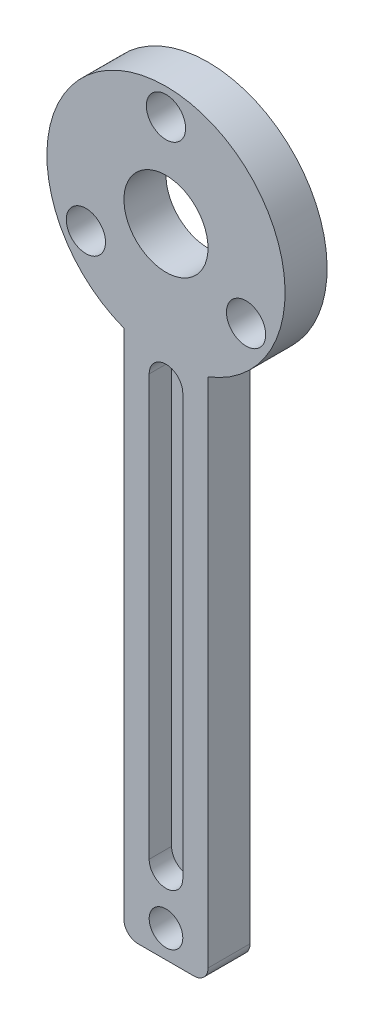
ISO-10303-21;
HEADER;
FILE_DESCRIPTION(('STEP AP214'),'2;1');
FILE_NAME('part.step','',(''),(''),'','','');
FILE_SCHEMA(('AUTOMOTIVE_DESIGN { 1 0 10303 214 1 1 1 1 }'));
ENDSEC;
DATA;
#1=APPLICATION_CONTEXT('core data for automotive mechanical design processes');
#2=APPLICATION_PROTOCOL_DEFINITION('international standard','automotive_design',2000,#1);
#3=PRODUCT_CONTEXT('',#1,'mechanical');
#4=PRODUCT('Part','Part','',(#3));
#5=PRODUCT_RELATED_PRODUCT_CATEGORY('part','',(#4));
#6=PRODUCT_DEFINITION_FORMATION('','',#4);
#7=PRODUCT_DEFINITION_CONTEXT('part definition',#1,'design');
#8=PRODUCT_DEFINITION('design','',#6,#7);
#9=PRODUCT_DEFINITION_SHAPE('','',#8);
#10=(LENGTH_UNIT() NAMED_UNIT(*) SI_UNIT(.MILLI.,.METRE.));
#11=(NAMED_UNIT(*) PLANE_ANGLE_UNIT() SI_UNIT($,.RADIAN.));
#12=(NAMED_UNIT(*) SI_UNIT($,.STERADIAN.) SOLID_ANGLE_UNIT());
#13=UNCERTAINTY_MEASURE_WITH_UNIT(LENGTH_MEASURE(1.E-05),#10,'distance_accuracy_value','');
#14=(GEOMETRIC_REPRESENTATION_CONTEXT(3) GLOBAL_UNCERTAINTY_ASSIGNED_CONTEXT((#13)) GLOBAL_UNIT_ASSIGNED_CONTEXT((#10,
#11,#12)) REPRESENTATION_CONTEXT('',''));
#15=CARTESIAN_POINT('',(0.,0.,0.));
#16=DIRECTION('',(0.,0.,1.));
#17=DIRECTION('',(1.,0.,0.));
#18=AXIS2_PLACEMENT_3D('',#15,#16,#17);
#19=CARTESIAN_POINT('',(1.5,0.75,0.75));
#20=DIRECTION('',(-1.,0.,0.));
#21=DIRECTION('',(0.,0.,1.));
#22=AXIS2_PLACEMENT_3D('',#19,#20,#21);
#23=PLANE('',#22);
#24=DIRECTION('',(0.,-1.,0.));
#25=VECTOR('',#24,1.);
#26=CARTESIAN_POINT('',(1.5,0.75,0.75));
#27=LINE('',#26,#25);
#28=CARTESIAN_POINT('',(1.5,18.0235065698533,0.75));
#29=VERTEX_POINT('',#28);
#30=CARTESIAN_POINT('',(1.5,-0.25,0.75));
#31=VERTEX_POINT('',#30);
#32=EDGE_CURVE('E203',#29,#31,#27,.T.);
#33=ORIENTED_EDGE('',*,*,#32,.T.);
#34=DIRECTION('',(0.,0.,-1.));
#35=VECTOR('',#34,1.);
#36=CARTESIAN_POINT('',(1.5,-0.25,-0.75));
#37=LINE('',#36,#35);
#38=CARTESIAN_POINT('',(1.5,-0.25,-0.75));
#39=VERTEX_POINT('',#38);
#40=EDGE_CURVE('E218',#31,#39,#37,.T.);
#41=ORIENTED_EDGE('',*,*,#40,.T.);
#42=DIRECTION('',(0.,-1.,0.));
#43=VECTOR('',#42,1.);
#44=CARTESIAN_POINT('',(1.5,0.75,-0.75));
#45=LINE('',#44,#43);
#46=CARTESIAN_POINT('',(1.5,18.0235065698533,-0.75));
#47=VERTEX_POINT('',#46);
#48=EDGE_CURVE('E214',#47,#39,#45,.T.);
#49=ORIENTED_EDGE('',*,*,#48,.F.);
#50=DIRECTION('',(0.,0.,-1.));
#51=VECTOR('',#50,1.);
#52=CARTESIAN_POINT('',(1.5,18.0235065698533,0.75));
#53=LINE('',#52,#51);
#54=EDGE_CURVE('E192',#29,#47,#53,.T.);
#55=ORIENTED_EDGE('',*,*,#54,.F.);
#56=EDGE_LOOP('',(#33,#41,#49,#55));
#57=FACE_BOUND('',#56,.T.);
#58=ADVANCED_FACE('F39',(#57),#23,.F.);
#59=CARTESIAN_POINT('',(-1.5,0.75,-0.75));
#60=DIRECTION('',(0.,0.,1.));
#61=DIRECTION('',(1.,0.,0.));
#62=AXIS2_PLACEMENT_3D('',#59,#60,#61);
#63=PLANE('',#62);
#64=CARTESIAN_POINT('',(0.,0.227167563847677,-0.75));
#65=DIRECTION('',(0.,0.,1.));
#66=DIRECTION('',(1.,0.,0.));
#67=AXIS2_PLACEMENT_3D('',#64,#65,#66);
#68=CIRCLE('',#67,0.6);
#69=CARTESIAN_POINT('',(0.600000000000001,0.227167563847677,-0.75));
#70=VERTEX_POINT('',#69);
#71=EDGE_CURVE('E146',#70,#70,#68,.T.);
#72=ORIENTED_EDGE('',*,*,#71,.T.);
#73=EDGE_LOOP('',(#72));
#74=FACE_BOUND('',#73,.T.);
#75=CARTESIAN_POINT('',(0.,25.3,-0.75));
#76=DIRECTION('',(0.,0.,1.));
#77=DIRECTION('',(1.,0.,0.));
#78=AXIS2_PLACEMENT_3D('',#75,#76,#77);
#79=CIRCLE('',#78,0.7);
#80=CARTESIAN_POINT('',(0.7,25.3,-0.75));
#81=VERTEX_POINT('',#80);
#82=EDGE_CURVE('E165',#81,#81,#79,.T.);
#83=ORIENTED_EDGE('',*,*,#82,.T.);
#84=EDGE_LOOP('',(#83));
#85=FACE_BOUND('',#84,.T.);
#86=CARTESIAN_POINT('',(0.,22.,-0.75));
#87=DIRECTION('',(0.,0.,1.));
#88=DIRECTION('',(1.,0.,0.));
#89=AXIS2_PLACEMENT_3D('',#86,#87,#88);
#90=CIRCLE('',#89,1.5);
#91=CARTESIAN_POINT('',(1.5,22.,-0.75));
#92=VERTEX_POINT('',#91);
#93=EDGE_CURVE('E160',#92,#92,#90,.T.);
#94=ORIENTED_EDGE('',*,*,#93,.T.);
#95=EDGE_LOOP('',(#94));
#96=FACE_BOUND('',#95,.T.);
#97=CARTESIAN_POINT('',(2.85788383248878,20.3500000000001,-0.75));
#98=DIRECTION('',(0.,0.,1.));
#99=DIRECTION('',(1.,0.,0.));
#100=AXIS2_PLACEMENT_3D('',#97,#98,#99);
#101=CIRCLE('',#100,0.699999999999997);
#102=CARTESIAN_POINT('',(3.55788383248877,20.3500000000001,-0.75));
#103=VERTEX_POINT('',#102);
#104=EDGE_CURVE('E174',#103,#103,#101,.T.);
#105=ORIENTED_EDGE('',*,*,#104,.T.);
#106=EDGE_LOOP('',(#105));
#107=FACE_BOUND('',#106,.T.);
#108=CARTESIAN_POINT('',(-2.85788383248853,20.3499999999999,-0.75));
#109=DIRECTION('',(0.,0.,1.));
#110=DIRECTION('',(1.,0.,0.));
#111=AXIS2_PLACEMENT_3D('',#108,#109,#110);
#112=CIRCLE('',#111,0.699999999999999);
#113=CARTESIAN_POINT('',(-2.15788383248853,20.3499999999999,-0.75));
#114=VERTEX_POINT('',#113);
#115=EDGE_CURVE('E179',#114,#114,#112,.T.);
#116=ORIENTED_EDGE('',*,*,#115,.T.);
#117=EDGE_LOOP('',(#116));
#118=FACE_BOUND('',#117,.T.);
#119=ORIENTED_EDGE('',*,*,#48,.T.);
#120=CARTESIAN_POINT('',(1.,-0.25,-0.75));
#121=DIRECTION('',(0.,0.,1.));
#122=DIRECTION('',(1.,0.,0.));
#123=AXIS2_PLACEMENT_3D('',#120,#121,#122);
#124=CIRCLE('',#123,0.5);
#125=CARTESIAN_POINT('',(1.,-0.75,-0.75));
#126=VERTEX_POINT('',#125);
#127=EDGE_CURVE('E221',#39,#126,#124,.F.);
#128=ORIENTED_EDGE('',*,*,#127,.T.);
#129=DIRECTION('',(-1.,0.,0.));
#130=VECTOR('',#129,1.);
#131=CARTESIAN_POINT('',(-1.5,-0.75,-0.75));
#132=LINE('',#131,#130);
#133=CARTESIAN_POINT('',(-0.999999999999999,-0.75,-0.75));
#134=VERTEX_POINT('',#133);
#135=EDGE_CURVE('E199',#126,#134,#132,.T.);
#136=ORIENTED_EDGE('',*,*,#135,.T.);
#137=CARTESIAN_POINT('',(-0.999999999999999,-0.25,-0.75));
#138=DIRECTION('',(0.,0.,1.));
#139=DIRECTION('',(1.,0.,0.));
#140=AXIS2_PLACEMENT_3D('',#137,#138,#139);
#141=CIRCLE('',#140,0.5);
#142=CARTESIAN_POINT('',(-1.5,-0.25,-0.75));
#143=VERTEX_POINT('',#142);
#144=EDGE_CURVE('E219',#134,#143,#141,.F.);
#145=ORIENTED_EDGE('',*,*,#144,.T.);
#146=DIRECTION('',(0.,-1.,0.));
#147=VECTOR('',#146,1.);
#148=CARTESIAN_POINT('',(-1.5,0.75,-0.75));
#149=LINE('',#148,#147);
#150=CARTESIAN_POINT('',(-1.5,18.0235065698533,-0.75));
#151=VERTEX_POINT('',#150);
#152=EDGE_CURVE('E208',#151,#143,#149,.T.);
#153=ORIENTED_EDGE('',*,*,#152,.F.);
#154=CARTESIAN_POINT('',(0.,22.,-0.75));
#155=DIRECTION('',(0.,0.,1.));
#156=DIRECTION('',(1.,0.,0.));
#157=AXIS2_PLACEMENT_3D('',#154,#155,#156);
#158=CIRCLE('',#157,4.25);
#159=EDGE_CURVE('E170',#47,#151,#158,.T.);
#160=ORIENTED_EDGE('',*,*,#159,.F.);
#161=EDGE_LOOP('',(#119,#128,#136,#145,#153,#160));
#162=FACE_BOUND('',#161,.T.);
#163=ADVANCED_FACE('F240',(#74,#85,#96,#107,#118,#162),#63,.F.);
#164=CARTESIAN_POINT('',(-1.5,0.75,0.75));
#165=DIRECTION('',(1.,0.,0.));
#166=DIRECTION('',(0.,0.,-1.));
#167=AXIS2_PLACEMENT_3D('',#164,#165,#166);
#168=PLANE('',#167);
#169=ORIENTED_EDGE('',*,*,#152,.T.);
#170=DIRECTION('',(0.,0.,1.));
#171=VECTOR('',#170,1.);
#172=CARTESIAN_POINT('',(-1.5,-0.25,0.75));
#173=LINE('',#172,#171);
#174=CARTESIAN_POINT('',(-1.5,-0.25,0.75));
#175=VERTEX_POINT('',#174);
#176=EDGE_CURVE('E11',#143,#175,#173,.T.);
#177=ORIENTED_EDGE('',*,*,#176,.T.);
#178=DIRECTION('',(0.,-1.,0.));
#179=VECTOR('',#178,1.);
#180=CARTESIAN_POINT('',(-1.5,0.75,0.75));
#181=LINE('',#180,#179);
#182=CARTESIAN_POINT('',(-1.5,18.0235065698533,0.75));
#183=VERTEX_POINT('',#182);
#184=EDGE_CURVE('E210',#183,#175,#181,.T.);
#185=ORIENTED_EDGE('',*,*,#184,.F.);
#186=DIRECTION('',(0.,0.,-1.));
#187=VECTOR('',#186,1.);
#188=CARTESIAN_POINT('',(-1.5,18.0235065698533,0.75));
#189=LINE('',#188,#187);
#190=EDGE_CURVE('E198',#183,#151,#189,.T.);
#191=ORIENTED_EDGE('',*,*,#190,.T.);
#192=EDGE_LOOP('',(#169,#177,#185,#191));
#193=FACE_BOUND('',#192,.T.);
#194=ADVANCED_FACE('F245',(#193),#168,.F.);
#195=CARTESIAN_POINT('',(-1.5,0.75,0.75));
#196=DIRECTION('',(0.,0.,-1.));
#197=DIRECTION('',(-1.,0.,0.));
#198=AXIS2_PLACEMENT_3D('',#195,#196,#197);
#199=PLANE('',#198);
#200=CARTESIAN_POINT('',(0.,0.227167563847677,0.75));
#201=DIRECTION('',(0.,0.,-1.));
#202=DIRECTION('',(-1.,0.,0.));
#203=AXIS2_PLACEMENT_3D('',#200,#201,#202);
#204=CIRCLE('',#203,0.6);
#205=CARTESIAN_POINT('',(-0.599999999999999,0.227167563847677,0.75));
#206=VERTEX_POINT('',#205);
#207=EDGE_CURVE('E43',#206,#206,#204,.T.);
#208=ORIENTED_EDGE('',*,*,#207,.T.);
#209=EDGE_LOOP('',(#208));
#210=FACE_BOUND('',#209,.T.);
#211=DIRECTION('',(0.,-1.,0.));
#212=VECTOR('',#211,1.);
#213=CARTESIAN_POINT('',(-0.600000000000001,17.0611346163572,0.75));
#214=LINE('',#213,#212);
#215=CARTESIAN_POINT('',(-0.600000000000001,17.0611346163572,0.75));
#216=VERTEX_POINT('',#215);
#217=CARTESIAN_POINT('',(-0.599999999999999,2.06113461635721,0.75));
#218=VERTEX_POINT('',#217);
#219=EDGE_CURVE('E154',#216,#218,#214,.T.);
#220=ORIENTED_EDGE('',*,*,#219,.F.);
#221=CARTESIAN_POINT('',(0.,17.0611346163572,0.75));
#222=DIRECTION('',(0.,0.,1.));
#223=DIRECTION('',(1.,0.,0.));
#224=AXIS2_PLACEMENT_3D('',#221,#222,#223);
#225=CIRCLE('',#224,0.6);
#226=CARTESIAN_POINT('',(0.599999999999999,17.0611346163572,0.75));
#227=VERTEX_POINT('',#226);
#228=EDGE_CURVE('E127',#227,#216,#225,.T.);
#229=ORIENTED_EDGE('',*,*,#228,.F.);
#230=DIRECTION('',(0.,1.,0.));
#231=VECTOR('',#230,1.);
#232=CARTESIAN_POINT('',(0.599999999999999,17.0611346163572,0.75));
#233=LINE('',#232,#231);
#234=CARTESIAN_POINT('',(0.600000000000001,2.06113461635721,0.75));
#235=VERTEX_POINT('',#234);
#236=EDGE_CURVE('E141',#235,#227,#233,.T.);
#237=ORIENTED_EDGE('',*,*,#236,.F.);
#238=CARTESIAN_POINT('',(0.,2.06113461635721,0.75));
#239=DIRECTION('',(0.,0.,1.));
#240=DIRECTION('',(1.,0.,0.));
#241=AXIS2_PLACEMENT_3D('',#238,#239,#240);
#242=CIRCLE('',#241,0.6);
#243=EDGE_CURVE('E147',#218,#235,#242,.T.);
#244=ORIENTED_EDGE('',*,*,#243,.F.);
#245=EDGE_LOOP('',(#220,#229,#237,#244));
#246=FACE_BOUND('',#245,.T.);
#247=CARTESIAN_POINT('',(0.,25.3,0.75));
#248=DIRECTION('',(0.,0.,1.));
#249=DIRECTION('',(1.,0.,0.));
#250=AXIS2_PLACEMENT_3D('',#247,#248,#249);
#251=CIRCLE('',#250,0.7);
#252=CARTESIAN_POINT('',(0.7,25.3,0.75));
#253=VERTEX_POINT('',#252);
#254=EDGE_CURVE('E166',#253,#253,#251,.T.);
#255=ORIENTED_EDGE('',*,*,#254,.F.);
#256=EDGE_LOOP('',(#255));
#257=FACE_BOUND('',#256,.T.);
#258=CARTESIAN_POINT('',(0.,22.,0.75));
#259=DIRECTION('',(0.,0.,1.));
#260=DIRECTION('',(1.,0.,0.));
#261=AXIS2_PLACEMENT_3D('',#258,#259,#260);
#262=CIRCLE('',#261,1.5);
#263=CARTESIAN_POINT('',(1.5,22.,0.75));
#264=VERTEX_POINT('',#263);
#265=EDGE_CURVE('E175',#264,#264,#262,.T.);
#266=ORIENTED_EDGE('',*,*,#265,.F.);
#267=EDGE_LOOP('',(#266));
#268=FACE_BOUND('',#267,.T.);
#269=CARTESIAN_POINT('',(2.85788383248878,20.3500000000001,0.75));
#270=DIRECTION('',(0.,0.,1.));
#271=DIRECTION('',(1.,0.,0.));
#272=AXIS2_PLACEMENT_3D('',#269,#270,#271);
#273=CIRCLE('',#272,0.699999999999997);
#274=CARTESIAN_POINT('',(3.55788383248877,20.3500000000001,0.75));
#275=VERTEX_POINT('',#274);
#276=EDGE_CURVE('E182',#275,#275,#273,.T.);
#277=ORIENTED_EDGE('',*,*,#276,.F.);
#278=EDGE_LOOP('',(#277));
#279=FACE_BOUND('',#278,.T.);
#280=CARTESIAN_POINT('',(-2.85788383248853,20.3499999999999,0.75));
#281=DIRECTION('',(0.,0.,1.));
#282=DIRECTION('',(1.,0.,0.));
#283=AXIS2_PLACEMENT_3D('',#280,#281,#282);
#284=CIRCLE('',#283,0.699999999999999);
#285=CARTESIAN_POINT('',(-2.15788383248853,20.3499999999999,0.75));
#286=VERTEX_POINT('',#285);
#287=EDGE_CURVE('E171',#286,#286,#284,.T.);
#288=ORIENTED_EDGE('',*,*,#287,.F.);
#289=EDGE_LOOP('',(#288));
#290=FACE_BOUND('',#289,.T.);
#291=DIRECTION('',(1.,0.,0.));
#292=VECTOR('',#291,1.);
#293=CARTESIAN_POINT('',(-1.5,-0.75,0.75));
#294=LINE('',#293,#292);
#295=CARTESIAN_POINT('',(-0.999999999999999,-0.75,0.75));
#296=VERTEX_POINT('',#295);
#297=CARTESIAN_POINT('',(1.,-0.75,0.75));
#298=VERTEX_POINT('',#297);
#299=EDGE_CURVE('E202',#296,#298,#294,.T.);
#300=ORIENTED_EDGE('',*,*,#299,.T.);
#301=CARTESIAN_POINT('',(1.,-0.25,0.75));
#302=DIRECTION('',(0.,0.,-1.));
#303=DIRECTION('',(-1.,0.,0.));
#304=AXIS2_PLACEMENT_3D('',#301,#302,#303);
#305=CIRCLE('',#304,0.5);
#306=EDGE_CURVE('E48',#298,#31,#305,.F.);
#307=ORIENTED_EDGE('',*,*,#306,.T.);
#308=ORIENTED_EDGE('',*,*,#32,.F.);
#309=CARTESIAN_POINT('',(0.,22.,0.75));
#310=DIRECTION('',(0.,0.,1.));
#311=DIRECTION('',(1.,0.,0.));
#312=AXIS2_PLACEMENT_3D('',#309,#310,#311);
#313=CIRCLE('',#312,4.25);
#314=EDGE_CURVE('E189',#29,#183,#313,.T.);
#315=ORIENTED_EDGE('',*,*,#314,.T.);
#316=ORIENTED_EDGE('',*,*,#184,.T.);
#317=CARTESIAN_POINT('',(-0.999999999999999,-0.25,0.75));
#318=DIRECTION('',(0.,0.,-1.));
#319=DIRECTION('',(-1.,0.,0.));
#320=AXIS2_PLACEMENT_3D('',#317,#318,#319);
#321=CIRCLE('',#320,0.5);
#322=EDGE_CURVE('E54',#175,#296,#321,.F.);
#323=ORIENTED_EDGE('',*,*,#322,.T.);
#324=EDGE_LOOP('',(#300,#307,#308,#315,#316,#323));
#325=FACE_BOUND('',#324,.T.);
#326=ADVANCED_FACE('F230',(#210,#246,#257,#268,#279,#290,#325),#199,.F.);
#327=CARTESIAN_POINT('',(0.,-0.75,0.));
#328=DIRECTION('',(0.,-1.,0.));
#329=DIRECTION('',(0.,0.,-1.));
#330=AXIS2_PLACEMENT_3D('',#327,#328,#329);
#331=PLANE('',#330);
#332=ORIENTED_EDGE('',*,*,#135,.F.);
#333=DIRECTION('',(0.,0.,-1.));
#334=VECTOR('',#333,1.);
#335=CARTESIAN_POINT('',(1.,-0.75,0.75));
#336=LINE('',#335,#334);
#337=EDGE_CURVE('E65',#126,#298,#336,.F.);
#338=ORIENTED_EDGE('',*,*,#337,.T.);
#339=ORIENTED_EDGE('',*,*,#299,.F.);
#340=DIRECTION('',(0.,0.,1.));
#341=VECTOR('',#340,1.);
#342=CARTESIAN_POINT('',(-0.999999999999999,-0.75,-0.75));
#343=LINE('',#342,#341);
#344=EDGE_CURVE('E224',#296,#134,#343,.F.);
#345=ORIENTED_EDGE('',*,*,#344,.T.);
#346=EDGE_LOOP('',(#332,#338,#339,#345));
#347=FACE_BOUND('',#346,.T.);
#348=ADVANCED_FACE('F239',(#347),#331,.T.);
#349=CARTESIAN_POINT('',(0.,22.,0.75));
#350=DIRECTION('',(0.,0.,-1.));
#351=DIRECTION('',(-1.,0.,0.));
#352=AXIS2_PLACEMENT_3D('',#349,#350,#351);
#353=CYLINDRICAL_SURFACE('',#352,4.25);
#354=ORIENTED_EDGE('',*,*,#159,.T.);
#355=ORIENTED_EDGE('',*,*,#190,.F.);
#356=ORIENTED_EDGE('',*,*,#314,.F.);
#357=ORIENTED_EDGE('',*,*,#54,.T.);
#358=EDGE_LOOP('',(#354,#355,#356,#357));
#359=FACE_BOUND('',#358,.T.);
#360=ADVANCED_FACE('F244',(#359),#353,.T.);
#361=CARTESIAN_POINT('',(-2.85788383248853,20.3499999999999,-0.75));
#362=DIRECTION('',(0.,0.,1.));
#363=DIRECTION('',(1.,0.,0.));
#364=AXIS2_PLACEMENT_3D('',#361,#362,#363);
#365=CYLINDRICAL_SURFACE('',#364,0.699999999999999);
#366=ORIENTED_EDGE('',*,*,#115,.F.);
#367=EDGE_LOOP('',(#366));
#368=FACE_BOUND('',#367,.T.);
#369=ORIENTED_EDGE('',*,*,#287,.T.);
#370=EDGE_LOOP('',(#369));
#371=FACE_BOUND('',#370,.T.);
#372=ADVANCED_FACE('F250',(#368,#371),#365,.F.);
#373=CARTESIAN_POINT('',(2.85788383248878,20.3500000000001,-0.75));
#374=DIRECTION('',(0.,0.,1.));
#375=DIRECTION('',(1.,0.,0.));
#376=AXIS2_PLACEMENT_3D('',#373,#374,#375);
#377=CYLINDRICAL_SURFACE('',#376,0.699999999999997);
#378=ORIENTED_EDGE('',*,*,#104,.F.);
#379=EDGE_LOOP('',(#378));
#380=FACE_BOUND('',#379,.T.);
#381=ORIENTED_EDGE('',*,*,#276,.T.);
#382=EDGE_LOOP('',(#381));
#383=FACE_BOUND('',#382,.T.);
#384=ADVANCED_FACE('F255',(#380,#383),#377,.F.);
#385=CARTESIAN_POINT('',(0.,22.,-0.75));
#386=DIRECTION('',(0.,0.,1.));
#387=DIRECTION('',(1.,0.,0.));
#388=AXIS2_PLACEMENT_3D('',#385,#386,#387);
#389=CYLINDRICAL_SURFACE('',#388,1.5);
#390=ORIENTED_EDGE('',*,*,#93,.F.);
#391=EDGE_LOOP('',(#390));
#392=FACE_BOUND('',#391,.T.);
#393=ORIENTED_EDGE('',*,*,#265,.T.);
#394=EDGE_LOOP('',(#393));
#395=FACE_BOUND('',#394,.T.);
#396=ADVANCED_FACE('F291',(#392,#395),#389,.F.);
#397=CARTESIAN_POINT('',(0.,25.3,-0.75));
#398=DIRECTION('',(0.,0.,1.));
#399=DIRECTION('',(1.,0.,0.));
#400=AXIS2_PLACEMENT_3D('',#397,#398,#399);
#401=CYLINDRICAL_SURFACE('',#400,0.7);
#402=ORIENTED_EDGE('',*,*,#82,.F.);
#403=EDGE_LOOP('',(#402));
#404=FACE_BOUND('',#403,.T.);
#405=ORIENTED_EDGE('',*,*,#254,.T.);
#406=EDGE_LOOP('',(#405));
#407=FACE_BOUND('',#406,.T.);
#408=ADVANCED_FACE('F290',(#404,#407),#401,.F.);
#409=CARTESIAN_POINT('',(0.,17.0611346163572,-0.0500000000000002));
#410=DIRECTION('',(0.,0.,1.));
#411=DIRECTION('',(1.,0.,0.));
#412=AXIS2_PLACEMENT_3D('',#409,#410,#411);
#413=CYLINDRICAL_SURFACE('',#412,0.6);
#414=ORIENTED_EDGE('',*,*,#228,.T.);
#415=DIRECTION('',(0.,0.,1.));
#416=VECTOR('',#415,1.);
#417=CARTESIAN_POINT('',(-0.600000000000001,17.0611346163572,-0.0500000000000002));
#418=LINE('',#417,#416);
#419=CARTESIAN_POINT('',(-0.600000000000001,17.0611346163572,-0.0500000000000002));
#420=VERTEX_POINT('',#419);
#421=EDGE_CURVE('E118',#420,#216,#418,.T.);
#422=ORIENTED_EDGE('',*,*,#421,.F.);
#423=CARTESIAN_POINT('',(0.,17.0611346163572,-0.0500000000000002));
#424=DIRECTION('',(0.,0.,1.));
#425=DIRECTION('',(1.,0.,0.));
#426=AXIS2_PLACEMENT_3D('',#423,#424,#425);
#427=CIRCLE('',#426,0.6);
#428=CARTESIAN_POINT('',(0.599999999999999,17.0611346163572,-0.0500000000000002));
#429=VERTEX_POINT('',#428);
#430=EDGE_CURVE('E124',#429,#420,#427,.T.);
#431=ORIENTED_EDGE('',*,*,#430,.F.);
#432=DIRECTION('',(0.,0.,1.));
#433=VECTOR('',#432,1.);
#434=CARTESIAN_POINT('',(0.599999999999999,17.0611346163572,-0.0500000000000002));
#435=LINE('',#434,#433);
#436=EDGE_CURVE('E159',#429,#227,#435,.T.);
#437=ORIENTED_EDGE('',*,*,#436,.T.);
#438=EDGE_LOOP('',(#414,#422,#431,#437));
#439=FACE_BOUND('',#438,.T.);
#440=ADVANCED_FACE('F122',(#439),#413,.F.);
#441=CARTESIAN_POINT('',(0.599999999999999,17.0611346163572,-0.0500000000000002));
#442=DIRECTION('',(1.,0.,0.));
#443=DIRECTION('',(0.,1.,0.));
#444=AXIS2_PLACEMENT_3D('',#441,#442,#443);
#445=PLANE('',#444);
#446=ORIENTED_EDGE('',*,*,#236,.T.);
#447=ORIENTED_EDGE('',*,*,#436,.F.);
#448=DIRECTION('',(0.,1.,0.));
#449=VECTOR('',#448,1.);
#450=CARTESIAN_POINT('',(0.599999999999999,17.0611346163572,-0.0500000000000002));
#451=LINE('',#450,#449);
#452=CARTESIAN_POINT('',(0.600000000000001,2.06113461635721,-0.0500000000000002));
#453=VERTEX_POINT('',#452);
#454=EDGE_CURVE('E133',#453,#429,#451,.T.);
#455=ORIENTED_EDGE('',*,*,#454,.F.);
#456=DIRECTION('',(0.,0.,1.));
#457=VECTOR('',#456,1.);
#458=CARTESIAN_POINT('',(0.600000000000001,2.06113461635721,-0.0500000000000002));
#459=LINE('',#458,#457);
#460=EDGE_CURVE('E163',#453,#235,#459,.T.);
#461=ORIENTED_EDGE('',*,*,#460,.T.);
#462=EDGE_LOOP('',(#446,#447,#455,#461));
#463=FACE_BOUND('',#462,.T.);
#464=ADVANCED_FACE('F283',(#463),#445,.F.);
#465=CARTESIAN_POINT('',(0.,2.06113461635721,-0.0500000000000002));
#466=DIRECTION('',(0.,0.,1.));
#467=DIRECTION('',(1.,0.,0.));
#468=AXIS2_PLACEMENT_3D('',#465,#466,#467);
#469=CYLINDRICAL_SURFACE('',#468,0.6);
#470=ORIENTED_EDGE('',*,*,#243,.T.);
#471=ORIENTED_EDGE('',*,*,#460,.F.);
#472=CARTESIAN_POINT('',(0.,2.06113461635721,-0.0500000000000002));
#473=DIRECTION('',(0.,0.,1.));
#474=DIRECTION('',(1.,0.,0.));
#475=AXIS2_PLACEMENT_3D('',#472,#473,#474);
#476=CIRCLE('',#475,0.6);
#477=CARTESIAN_POINT('',(-0.599999999999999,2.06113461635721,-0.0500000000000002));
#478=VERTEX_POINT('',#477);
#479=EDGE_CURVE('E138',#478,#453,#476,.T.);
#480=ORIENTED_EDGE('',*,*,#479,.F.);
#481=DIRECTION('',(0.,0.,1.));
#482=VECTOR('',#481,1.);
#483=CARTESIAN_POINT('',(-0.599999999999999,2.06113461635721,-0.0500000000000002));
#484=LINE('',#483,#482);
#485=EDGE_CURVE('E128',#478,#218,#484,.T.);
#486=ORIENTED_EDGE('',*,*,#485,.T.);
#487=EDGE_LOOP('',(#470,#471,#480,#486));
#488=FACE_BOUND('',#487,.T.);
#489=ADVANCED_FACE('F280',(#488),#469,.F.);
#490=CARTESIAN_POINT('',(-0.600000000000001,17.0611346163572,-0.0500000000000002));
#491=DIRECTION('',(-1.,0.,0.));
#492=DIRECTION('',(0.,-1.,0.));
#493=AXIS2_PLACEMENT_3D('',#490,#491,#492);
#494=PLANE('',#493);
#495=ORIENTED_EDGE('',*,*,#219,.T.);
#496=ORIENTED_EDGE('',*,*,#485,.F.);
#497=DIRECTION('',(0.,-1.,0.));
#498=VECTOR('',#497,1.);
#499=CARTESIAN_POINT('',(-0.600000000000001,17.0611346163572,-0.0500000000000002));
#500=LINE('',#499,#498);
#501=EDGE_CURVE('E134',#420,#478,#500,.T.);
#502=ORIENTED_EDGE('',*,*,#501,.F.);
#503=ORIENTED_EDGE('',*,*,#421,.T.);
#504=EDGE_LOOP('',(#495,#496,#502,#503));
#505=FACE_BOUND('',#504,.T.);
#506=ADVANCED_FACE('F132',(#505),#494,.F.);
#507=CARTESIAN_POINT('',(0.,17.0611346163572,-0.0500000000000002));
#508=DIRECTION('',(0.,0.,1.));
#509=DIRECTION('',(1.,0.,0.));
#510=AXIS2_PLACEMENT_3D('',#507,#508,#509);
#511=PLANE('',#510);
#512=ORIENTED_EDGE('',*,*,#430,.T.);
#513=ORIENTED_EDGE('',*,*,#501,.T.);
#514=ORIENTED_EDGE('',*,*,#479,.T.);
#515=ORIENTED_EDGE('',*,*,#454,.T.);
#516=EDGE_LOOP('',(#512,#513,#514,#515));
#517=FACE_BOUND('',#516,.T.);
#518=ADVANCED_FACE('F142',(#517),#511,.T.);
#519=CARTESIAN_POINT('',(1.,-0.25,0.75));
#520=DIRECTION('',(0.,0.,1.));
#521=DIRECTION('',(1.,0.,0.));
#522=AXIS2_PLACEMENT_3D('',#519,#520,#521);
#523=CYLINDRICAL_SURFACE('',#522,0.5);
#524=ORIENTED_EDGE('',*,*,#306,.F.);
#525=ORIENTED_EDGE('',*,*,#337,.F.);
#526=ORIENTED_EDGE('',*,*,#127,.F.);
#527=ORIENTED_EDGE('',*,*,#40,.F.);
#528=EDGE_LOOP('',(#524,#525,#526,#527));
#529=FACE_BOUND('',#528,.T.);
#530=ADVANCED_FACE('F232',(#529),#523,.T.);
#531=CARTESIAN_POINT('',(-0.999999999999999,-0.25,0.75));
#532=DIRECTION('',(0.,0.,-1.));
#533=DIRECTION('',(-1.,0.,0.));
#534=AXIS2_PLACEMENT_3D('',#531,#532,#533);
#535=CYLINDRICAL_SURFACE('',#534,0.5);
#536=ORIENTED_EDGE('',*,*,#144,.F.);
#537=ORIENTED_EDGE('',*,*,#344,.F.);
#538=ORIENTED_EDGE('',*,*,#322,.F.);
#539=ORIENTED_EDGE('',*,*,#176,.F.);
#540=EDGE_LOOP('',(#536,#537,#538,#539));
#541=FACE_BOUND('',#540,.T.);
#542=ADVANCED_FACE('F41',(#541),#535,.T.);
#543=CARTESIAN_POINT('',(0.,0.227167563847677,-4.));
#544=DIRECTION('',(0.,0.,1.));
#545=DIRECTION('',(1.,0.,0.));
#546=AXIS2_PLACEMENT_3D('',#543,#544,#545);
#547=CYLINDRICAL_SURFACE('',#546,0.6);
#548=ORIENTED_EDGE('',*,*,#207,.F.);
#549=EDGE_LOOP('',(#548));
#550=FACE_BOUND('',#549,.T.);
#551=ORIENTED_EDGE('',*,*,#71,.F.);
#552=EDGE_LOOP('',(#551));
#553=FACE_BOUND('',#552,.T.);
#554=ADVANCED_FACE('F275',(#550,#553),#547,.F.);
#555=CLOSED_SHELL('',(#58,#163,#194,#326,#348,#360,#372,#384,#396,#408,#440,#464,#489,#506,#518,
#530,#542,#554));
#556=MANIFOLD_SOLID_BREP('B2',#555);
#557=ADVANCED_BREP_SHAPE_REPRESENTATION('',(#18,#556),#14);
#558=SHAPE_DEFINITION_REPRESENTATION(#9,#557);
ENDSEC;
END-ISO-10303-21;
